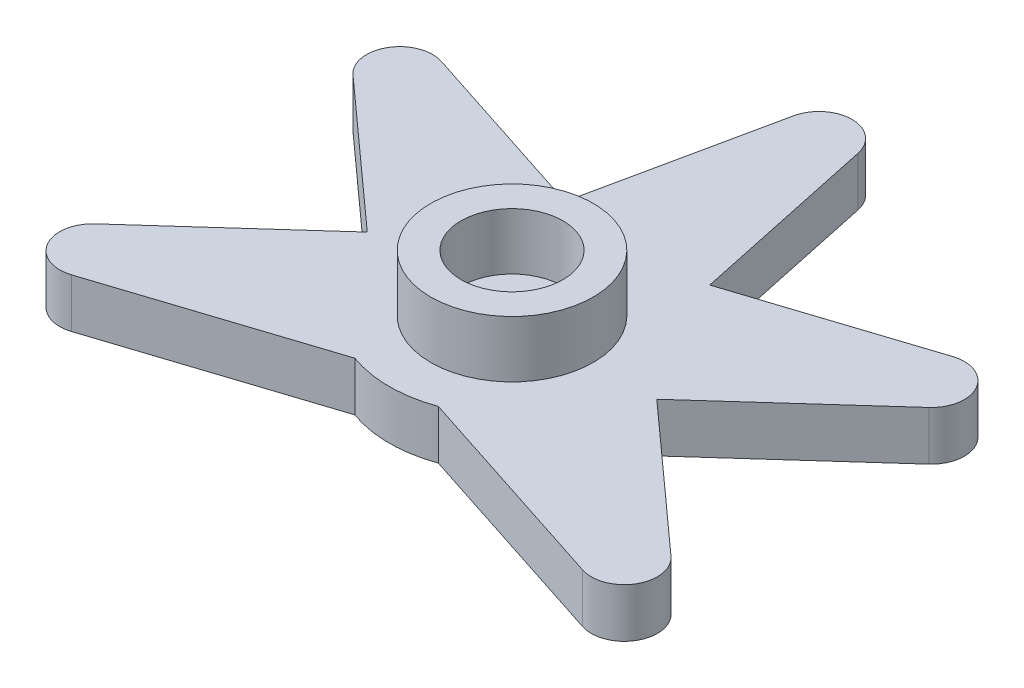
ISO-10303-21;
HEADER;
FILE_DESCRIPTION(('STEP AP214'),'2;1');
FILE_NAME('part.step','',(''),(''),'','','');
FILE_SCHEMA(('AUTOMOTIVE_DESIGN { 1 0 10303 214 1 1 1 1 }'));
ENDSEC;
DATA;
#1=APPLICATION_CONTEXT('core data for automotive mechanical design processes');
#2=APPLICATION_PROTOCOL_DEFINITION('international standard','automotive_design',2000,#1);
#3=PRODUCT_CONTEXT('',#1,'mechanical');
#4=PRODUCT('Part','Part','',(#3));
#5=PRODUCT_RELATED_PRODUCT_CATEGORY('part','',(#4));
#6=PRODUCT_DEFINITION_FORMATION('','',#4);
#7=PRODUCT_DEFINITION_CONTEXT('part definition',#1,'design');
#8=PRODUCT_DEFINITION('design','',#6,#7);
#9=PRODUCT_DEFINITION_SHAPE('','',#8);
#10=(LENGTH_UNIT() NAMED_UNIT(*) SI_UNIT(.MILLI.,.METRE.));
#11=(NAMED_UNIT(*) PLANE_ANGLE_UNIT() SI_UNIT($,.RADIAN.));
#12=(NAMED_UNIT(*) SI_UNIT($,.STERADIAN.) SOLID_ANGLE_UNIT());
#13=UNCERTAINTY_MEASURE_WITH_UNIT(LENGTH_MEASURE(1.E-05),#10,'distance_accuracy_value','');
#14=(GEOMETRIC_REPRESENTATION_CONTEXT(3) GLOBAL_UNCERTAINTY_ASSIGNED_CONTEXT((#13)) GLOBAL_UNIT_ASSIGNED_CONTEXT((#10,
#11,#12)) REPRESENTATION_CONTEXT('',''));
#15=CARTESIAN_POINT('',(0.,0.,0.));
#16=DIRECTION('',(0.,0.,1.));
#17=DIRECTION('',(1.,0.,0.));
#18=AXIS2_PLACEMENT_3D('',#15,#16,#17);
#19=CARTESIAN_POINT('',(0.,2.6,0.));
#20=DIRECTION('',(0.,1.,0.));
#21=DIRECTION('',(0.,0.,1.));
#22=AXIS2_PLACEMENT_3D('',#19,#20,#21);
#23=PLANE('',#22);
#24=CARTESIAN_POINT('',(0.,2.6,0.));
#25=DIRECTION('',(0.,1.,0.));
#26=DIRECTION('',(0.,0.,1.));
#27=AXIS2_PLACEMENT_3D('',#24,#25,#26);
#28=CIRCLE('',#27,1.5);
#29=CARTESIAN_POINT('',(0.,2.6,1.5));
#30=VERTEX_POINT('',#29);
#31=EDGE_CURVE('E197',#30,#30,#28,.T.);
#32=ORIENTED_EDGE('',*,*,#31,.F.);
#33=EDGE_LOOP('',(#32));
#34=FACE_BOUND('',#33,.T.);
#35=CARTESIAN_POINT('',(0.,2.6,0.));
#36=DIRECTION('',(0.,1.,0.));
#37=DIRECTION('',(0.,0.,1.));
#38=AXIS2_PLACEMENT_3D('',#35,#36,#37);
#39=CIRCLE('',#38,2.7);
#40=CARTESIAN_POINT('',(0.,2.6,2.7));
#41=VERTEX_POINT('',#40);
#42=EDGE_CURVE('E11',#41,#41,#39,.F.);
#43=ORIENTED_EDGE('',*,*,#42,.F.);
#44=EDGE_LOOP('',(#43));
#45=FACE_BOUND('',#44,.T.);
#46=ADVANCED_FACE('F41',(#34,#45),#23,.T.);
#47=CARTESIAN_POINT('',(0.,2.6,0.));
#48=DIRECTION('',(0.,-1.,0.));
#49=DIRECTION('',(0.,0.,-1.));
#50=AXIS2_PLACEMENT_3D('',#47,#48,#49);
#51=CYLINDRICAL_SURFACE('',#50,6.5);
#52=CARTESIAN_POINT('',(0.,0.,0.));
#53=DIRECTION('',(0.,1.,0.));
#54=DIRECTION('',(0.,0.,1.));
#55=AXIS2_PLACEMENT_3D('',#52,#53,#54);
#56=CIRCLE('',#55,6.5);
#57=CARTESIAN_POINT('',(2.21320415241707,0.,6.1116059574979));
#58=VERTEX_POINT('',#57);
#59=CARTESIAN_POINT('',(-2.21320415241724,0.,6.11160595749784));
#60=VERTEX_POINT('',#59);
#61=EDGE_CURVE('E204',#58,#60,#56,.F.);
#62=ORIENTED_EDGE('',*,*,#61,.F.);
#63=DIRECTION('',(0.,-1.,0.));
#64=VECTOR('',#63,1.);
#65=CARTESIAN_POINT('',(2.21320415241707,2.6,6.1116059574979));
#66=LINE('',#65,#64);
#67=CARTESIAN_POINT('',(2.21320415241707,2.6,6.1116059574979));
#68=VERTEX_POINT('',#67);
#69=EDGE_CURVE('E51',#68,#58,#66,.T.);
#70=ORIENTED_EDGE('',*,*,#69,.F.);
#71=CARTESIAN_POINT('',(0.,2.6,0.));
#72=DIRECTION('',(0.,1.,0.));
#73=DIRECTION('',(0.,0.,1.));
#74=AXIS2_PLACEMENT_3D('',#71,#72,#73);
#75=CIRCLE('',#74,6.5);
#76=CARTESIAN_POINT('',(-2.21320415241724,2.6,6.11160595749784));
#77=VERTEX_POINT('',#76);
#78=EDGE_CURVE('E263',#68,#77,#75,.F.);
#79=ORIENTED_EDGE('',*,*,#78,.T.);
#80=DIRECTION('',(0.,-1.,0.));
#81=VECTOR('',#80,1.);
#82=CARTESIAN_POINT('',(-2.21320415241724,2.6,6.11160595749784));
#83=LINE('',#82,#81);
#84=EDGE_CURVE('E129',#77,#60,#83,.T.);
#85=ORIENTED_EDGE('',*,*,#84,.T.);
#86=EDGE_LOOP('',(#62,#70,#79,#85));
#87=FACE_BOUND('',#86,.T.);
#88=ADVANCED_FACE('F43',(#87),#51,.T.);
#89=CARTESIAN_POINT('',(-1.58481373427491,2.6,4.87755513946669));
#90=DIRECTION('',(-0.309016994374972,0.,0.951056516295146));
#91=DIRECTION('',(0.951056516295146,0.,0.309016994374972));
#92=AXIS2_PLACEMENT_3D('',#89,#90,#91);
#93=PLANE('',#92);
#94=DIRECTION('',(-0.951056516295146,0.,-0.309016994374972));
#95=VECTOR('',#94,1.);
#96=CARTESIAN_POINT('',(-1.58481373427491,0.,4.87755513946669));
#97=LINE('',#96,#95);
#98=CARTESIAN_POINT('',(13.5321330713408,0.,9.78934890351677));
#99=VERTEX_POINT('',#98);
#100=EDGE_CURVE('E208',#99,#58,#97,.T.);
#101=ORIENTED_EDGE('',*,*,#100,.F.);
#102=DIRECTION('',(0.,-1.,0.));
#103=VECTOR('',#102,1.);
#104=CARTESIAN_POINT('',(13.5321330713408,2.6,9.78934890351677));
#105=LINE('',#104,#103);
#106=CARTESIAN_POINT('',(13.5321330713408,2.6,9.78934890351677));
#107=VERTEX_POINT('',#106);
#108=EDGE_CURVE('E294',#107,#99,#105,.T.);
#109=ORIENTED_EDGE('',*,*,#108,.F.);
#110=DIRECTION('',(-0.951056516295146,0.,-0.309016994374972));
#111=VECTOR('',#110,1.);
#112=CARTESIAN_POINT('',(-1.58481373427491,2.6,4.87755513946669));
#113=LINE('',#112,#111);
#114=EDGE_CURVE('E304',#107,#68,#113,.T.);
#115=ORIENTED_EDGE('',*,*,#114,.T.);
#116=ORIENTED_EDGE('',*,*,#69,.T.);
#117=EDGE_LOOP('',(#101,#109,#115,#116));
#118=FACE_BOUND('',#117,.T.);
#119=ADVANCED_FACE('F302',(#118),#93,.T.);
#120=CARTESIAN_POINT('',(14.072912811497,2.6,8.12500000000026));
#121=DIRECTION('',(0.,-1.,0.));
#122=DIRECTION('',(0.,0.,-1.));
#123=AXIS2_PLACEMENT_3D('',#120,#121,#122);
#124=CYLINDRICAL_SURFACE('',#123,1.75);
#125=CARTESIAN_POINT('',(14.072912811497,0.,8.12500000000026));
#126=DIRECTION('',(0.,1.,0.));
#127=DIRECTION('',(0.,0.,1.));
#128=AXIS2_PLACEMENT_3D('',#125,#126,#127);
#129=CIRCLE('',#128,1.75);
#130=CARTESIAN_POINT('',(15.243891372625,0.,6.82449655541483));
#131=VERTEX_POINT('',#130);
#132=EDGE_CURVE('E213',#131,#99,#129,.F.);
#133=ORIENTED_EDGE('',*,*,#132,.F.);
#134=DIRECTION('',(0.,-1.,0.));
#135=VECTOR('',#134,1.);
#136=CARTESIAN_POINT('',(15.243891372625,2.6,6.82449655541483));
#137=LINE('',#136,#135);
#138=CARTESIAN_POINT('',(15.243891372625,2.6,6.82449655541483));
#139=VERTEX_POINT('',#138);
#140=EDGE_CURVE('E291',#139,#131,#137,.T.);
#141=ORIENTED_EDGE('',*,*,#140,.F.);
#142=CARTESIAN_POINT('',(14.072912811497,2.6,8.12500000000026));
#143=DIRECTION('',(0.,1.,0.));
#144=DIRECTION('',(0.,0.,1.));
#145=AXIS2_PLACEMENT_3D('',#142,#143,#144);
#146=CIRCLE('',#145,1.75);
#147=EDGE_CURVE('E315',#139,#107,#146,.F.);
#148=ORIENTED_EDGE('',*,*,#147,.T.);
#149=ORIENTED_EDGE('',*,*,#108,.T.);
#150=EDGE_LOOP('',(#133,#141,#148,#149));
#151=FACE_BOUND('',#150,.T.);
#152=ADVANCED_FACE('F311',(#151),#124,.T.);
#153=CARTESIAN_POINT('',(3.43167979200019,2.6,-3.81126652388177));
#154=DIRECTION('',(-0.669130606358867,0.,0.743144825477386));
#155=DIRECTION('',(0.743144825477386,0.,0.669130606358867));
#156=AXIS2_PLACEMENT_3D('',#153,#154,#155);
#157=PLANE('',#156);
#158=DIRECTION('',(-0.743144825477386,0.,-0.669130606358867));
#159=VECTOR('',#158,1.);
#160=CARTESIAN_POINT('',(3.43167979200019,0.,-3.81126652388177));
#161=LINE('',#160,#159);
#162=CARTESIAN_POINT('',(7.6645200907729,0.,1.43765208071578E-13));
#163=VERTEX_POINT('',#162);
#164=EDGE_CURVE('E217',#131,#163,#161,.T.);
#165=ORIENTED_EDGE('',*,*,#164,.T.);
#166=DIRECTION('',(0.,-1.,0.));
#167=VECTOR('',#166,1.);
#168=CARTESIAN_POINT('',(7.6645200907729,2.6,1.43765208071578E-13));
#169=LINE('',#168,#167);
#170=CARTESIAN_POINT('',(7.6645200907729,2.6,1.43765208071578E-13));
#171=VERTEX_POINT('',#170);
#172=EDGE_CURVE('E288',#171,#163,#169,.T.);
#173=ORIENTED_EDGE('',*,*,#172,.F.);
#174=DIRECTION('',(-0.743144825477386,0.,-0.669130606358867));
#175=VECTOR('',#174,1.);
#176=CARTESIAN_POINT('',(3.43167979200019,2.6,-3.81126652388177));
#177=LINE('',#176,#175);
#178=EDGE_CURVE('E318',#139,#171,#177,.T.);
#179=ORIENTED_EDGE('',*,*,#178,.F.);
#180=ORIENTED_EDGE('',*,*,#140,.T.);
#181=EDGE_LOOP('',(#165,#173,#179,#180));
#182=FACE_BOUND('',#181,.T.);
#183=ADVANCED_FACE('F560',(#182),#157,.F.);
#184=CARTESIAN_POINT('',(3.43167979200028,2.6,3.81126652388192));
#185=DIRECTION('',(0.669130606358861,0.,0.743144825477392));
#186=DIRECTION('',(0.743144825477392,0.,-0.669130606358861));
#187=AXIS2_PLACEMENT_3D('',#184,#185,#186);
#188=PLANE('',#187);
#189=DIRECTION('',(-0.743144825477392,0.,0.669130606358861));
#190=VECTOR('',#189,1.);
#191=CARTESIAN_POINT('',(3.43167979200028,0.,3.81126652388192));
#192=LINE('',#191,#190);
#193=CARTESIAN_POINT('',(15.2438913726251,0.,-6.82449655541456));
#194=VERTEX_POINT('',#193);
#195=EDGE_CURVE('E221',#194,#163,#192,.T.);
#196=ORIENTED_EDGE('',*,*,#195,.F.);
#197=DIRECTION('',(0.,-1.,0.));
#198=VECTOR('',#197,1.);
#199=CARTESIAN_POINT('',(15.2438913726251,2.6,-6.82449655541456));
#200=LINE('',#199,#198);
#201=CARTESIAN_POINT('',(15.2438913726251,2.6,-6.82449655541456));
#202=VERTEX_POINT('',#201);
#203=EDGE_CURVE('E285',#202,#194,#200,.T.);
#204=ORIENTED_EDGE('',*,*,#203,.F.);
#205=DIRECTION('',(-0.743144825477392,0.,0.669130606358861));
#206=VECTOR('',#205,1.);
#207=CARTESIAN_POINT('',(3.43167979200028,2.6,3.81126652388192));
#208=LINE('',#207,#206);
#209=EDGE_CURVE('E325',#202,#171,#208,.T.);
#210=ORIENTED_EDGE('',*,*,#209,.T.);
#211=ORIENTED_EDGE('',*,*,#172,.T.);
#212=EDGE_LOOP('',(#196,#204,#210,#211));
#213=FACE_BOUND('',#212,.T.);
#214=ADVANCED_FACE('F551',(#213),#188,.T.);
#215=CARTESIAN_POINT('',(14.0729128114971,2.6,-8.125));
#216=DIRECTION('',(0.,-1.,0.));
#217=DIRECTION('',(0.,0.,-1.));
#218=AXIS2_PLACEMENT_3D('',#215,#216,#217);
#219=CYLINDRICAL_SURFACE('',#218,1.75);
#220=CARTESIAN_POINT('',(14.0729128114971,0.,-8.125));
#221=DIRECTION('',(0.,1.,0.));
#222=DIRECTION('',(0.,0.,1.));
#223=AXIS2_PLACEMENT_3D('',#220,#221,#222);
#224=CIRCLE('',#223,1.75);
#225=CARTESIAN_POINT('',(13.532133071341,0.,-9.78934890351652));
#226=VERTEX_POINT('',#225);
#227=EDGE_CURVE('E225',#226,#194,#224,.F.);
#228=ORIENTED_EDGE('',*,*,#227,.F.);
#229=DIRECTION('',(0.,-1.,0.));
#230=VECTOR('',#229,1.);
#231=CARTESIAN_POINT('',(13.532133071341,2.6,-9.78934890351652));
#232=LINE('',#231,#230);
#233=CARTESIAN_POINT('',(13.532133071341,2.6,-9.78934890351652));
#234=VERTEX_POINT('',#233);
#235=EDGE_CURVE('E282',#234,#226,#232,.T.);
#236=ORIENTED_EDGE('',*,*,#235,.F.);
#237=CARTESIAN_POINT('',(14.0729128114971,2.6,-8.125));
#238=DIRECTION('',(0.,1.,0.));
#239=DIRECTION('',(0.,0.,1.));
#240=AXIS2_PLACEMENT_3D('',#237,#238,#239);
#241=CIRCLE('',#240,1.75);
#242=EDGE_CURVE('E329',#234,#202,#241,.F.);
#243=ORIENTED_EDGE('',*,*,#242,.T.);
#244=ORIENTED_EDGE('',*,*,#203,.T.);
#245=EDGE_LOOP('',(#228,#236,#243,#244));
#246=FACE_BOUND('',#245,.T.);
#247=ADVANCED_FACE('F542',(#246),#219,.T.);
#248=CARTESIAN_POINT('',(-1.58481373427482,2.6,-4.87755513946679));
#249=DIRECTION('',(0.30901699437495,0.,0.951056516295153));
#250=DIRECTION('',(0.951056516295153,0.,-0.30901699437495));
#251=AXIS2_PLACEMENT_3D('',#248,#249,#250);
#252=PLANE('',#251);
#253=DIRECTION('',(-0.951056516295153,0.,0.30901699437495));
#254=VECTOR('',#253,1.);
#255=CARTESIAN_POINT('',(-1.58481373427482,0.,-4.87755513946679));
#256=LINE('',#255,#254);
#257=CARTESIAN_POINT('',(3.83226004538644,0.,-6.63766910642558));
#258=VERTEX_POINT('',#257);
#259=EDGE_CURVE('E229',#226,#258,#256,.T.);
#260=ORIENTED_EDGE('',*,*,#259,.T.);
#261=DIRECTION('',(0.,-1.,0.));
#262=VECTOR('',#261,1.);
#263=CARTESIAN_POINT('',(3.83226004538644,2.6,-6.63766910642558));
#264=LINE('',#263,#262);
#265=CARTESIAN_POINT('',(3.83226004538644,2.6,-6.63766910642558));
#266=VERTEX_POINT('',#265);
#267=EDGE_CURVE('E279',#266,#258,#264,.T.);
#268=ORIENTED_EDGE('',*,*,#267,.F.);
#269=DIRECTION('',(-0.951056516295153,0.,0.30901699437495));
#270=VECTOR('',#269,1.);
#271=CARTESIAN_POINT('',(-1.58481373427482,2.6,-4.87755513946679));
#272=LINE('',#271,#270);
#273=EDGE_CURVE('E333',#234,#266,#272,.T.);
#274=ORIENTED_EDGE('',*,*,#273,.F.);
#275=ORIENTED_EDGE('',*,*,#235,.T.);
#276=EDGE_LOOP('',(#260,#268,#274,#275));
#277=FACE_BOUND('',#276,.T.);
#278=ADVANCED_FACE('F531',(#277),#252,.F.);
#279=CARTESIAN_POINT('',(5.01649352627494,2.6,-1.06628861558489));
#280=DIRECTION('',(0.978147600733807,0.,-0.207911690817753));
#281=DIRECTION('',(-0.207911690817753,0.,-0.978147600733807));
#282=AXIS2_PLACEMENT_3D('',#279,#280,#281);
#283=PLANE('',#282);
#284=DIRECTION('',(0.207911690817753,0.,0.978147600733807));
#285=VECTOR('',#284,1.);
#286=CARTESIAN_POINT('',(5.01649352627494,0.,-1.06628861558489));
#287=LINE('',#286,#285);
#288=CARTESIAN_POINT('',(1.71175830128416,0.,-16.6138454589311));
#289=VERTEX_POINT('',#288);
#290=EDGE_CURVE('E233',#289,#258,#287,.T.);
#291=ORIENTED_EDGE('',*,*,#290,.F.);
#292=DIRECTION('',(0.,-1.,0.));
#293=VECTOR('',#292,1.);
#294=CARTESIAN_POINT('',(1.71175830128416,2.6,-16.6138454589311));
#295=LINE('',#294,#293);
#296=CARTESIAN_POINT('',(1.71175830128416,2.6,-16.6138454589311));
#297=VERTEX_POINT('',#296);
#298=EDGE_CURVE('E277',#297,#289,#295,.T.);
#299=ORIENTED_EDGE('',*,*,#298,.F.);
#300=DIRECTION('',(0.207911690817753,0.,0.978147600733807));
#301=VECTOR('',#300,1.);
#302=CARTESIAN_POINT('',(5.01649352627494,2.6,-1.06628861558489));
#303=LINE('',#302,#301);
#304=EDGE_CURVE('E336',#297,#266,#303,.T.);
#305=ORIENTED_EDGE('',*,*,#304,.T.);
#306=ORIENTED_EDGE('',*,*,#267,.T.);
#307=EDGE_LOOP('',(#291,#299,#305,#306));
#308=FACE_BOUND('',#307,.T.);
#309=ADVANCED_FACE('F521',(#308),#283,.T.);
#310=CARTESIAN_POINT('',(0.,2.6,-16.25));
#311=DIRECTION('',(0.,-1.,0.));
#312=DIRECTION('',(0.,0.,-1.));
#313=AXIS2_PLACEMENT_3D('',#310,#311,#312);
#314=CYLINDRICAL_SURFACE('',#313,1.75);
#315=CARTESIAN_POINT('',(0.,0.,-16.25));
#316=DIRECTION('',(0.,1.,0.));
#317=DIRECTION('',(0.,0.,1.));
#318=AXIS2_PLACEMENT_3D('',#315,#316,#317);
#319=CIRCLE('',#318,1.75);
#320=CARTESIAN_POINT('',(-1.71175830128416,0.,-16.6138454589311));
#321=VERTEX_POINT('',#320);
#322=EDGE_CURVE('E237',#321,#289,#319,.F.);
#323=ORIENTED_EDGE('',*,*,#322,.F.);
#324=DIRECTION('',(0.,-1.,0.));
#325=VECTOR('',#324,1.);
#326=CARTESIAN_POINT('',(-1.71175830128416,2.6,-16.6138454589311));
#327=LINE('',#326,#325);
#328=CARTESIAN_POINT('',(-1.71175830128416,2.6,-16.6138454589311));
#329=VERTEX_POINT('',#328);
#330=EDGE_CURVE('E275',#329,#321,#327,.T.);
#331=ORIENTED_EDGE('',*,*,#330,.F.);
#332=CARTESIAN_POINT('',(0.,2.6,-16.25));
#333=DIRECTION('',(0.,1.,0.));
#334=DIRECTION('',(0.,0.,1.));
#335=AXIS2_PLACEMENT_3D('',#332,#333,#334);
#336=CIRCLE('',#335,1.75);
#337=EDGE_CURVE('E339',#329,#297,#336,.F.);
#338=ORIENTED_EDGE('',*,*,#337,.T.);
#339=ORIENTED_EDGE('',*,*,#298,.T.);
#340=EDGE_LOOP('',(#323,#331,#338,#339));
#341=FACE_BOUND('',#340,.T.);
#342=ADVANCED_FACE('F511',(#341),#314,.T.);
#343=CARTESIAN_POINT('',(-5.01649352627494,2.6,-1.06628861558489));
#344=DIRECTION('',(0.978147600733807,0.,0.207911690817753));
#345=DIRECTION('',(0.207911690817753,0.,-0.978147600733807));
#346=AXIS2_PLACEMENT_3D('',#343,#344,#345);
#347=PLANE('',#346);
#348=DIRECTION('',(-0.207911690817753,0.,0.978147600733807));
#349=VECTOR('',#348,1.);
#350=CARTESIAN_POINT('',(-5.01649352627494,0.,-1.06628861558489));
#351=LINE('',#350,#349);
#352=CARTESIAN_POINT('',(-3.83226004538643,0.,-6.63766910642561));
#353=VERTEX_POINT('',#352);
#354=EDGE_CURVE('E240',#321,#353,#351,.T.);
#355=ORIENTED_EDGE('',*,*,#354,.T.);
#356=DIRECTION('',(0.,-1.,0.));
#357=VECTOR('',#356,1.);
#358=CARTESIAN_POINT('',(-3.83226004538643,2.6,-6.63766910642561));
#359=LINE('',#358,#357);
#360=CARTESIAN_POINT('',(-3.83226004538643,2.6,-6.63766910642561));
#361=VERTEX_POINT('',#360);
#362=EDGE_CURVE('E272',#361,#353,#359,.T.);
#363=ORIENTED_EDGE('',*,*,#362,.F.);
#364=DIRECTION('',(-0.207911690817753,0.,0.978147600733807));
#365=VECTOR('',#364,1.);
#366=CARTESIAN_POINT('',(-5.01649352627494,2.6,-1.06628861558489));
#367=LINE('',#366,#365);
#368=EDGE_CURVE('E342',#329,#361,#367,.T.);
#369=ORIENTED_EDGE('',*,*,#368,.F.);
#370=ORIENTED_EDGE('',*,*,#330,.T.);
#371=EDGE_LOOP('',(#355,#363,#369,#370));
#372=FACE_BOUND('',#371,.T.);
#373=ADVANCED_FACE('F502',(#372),#347,.F.);
#374=CARTESIAN_POINT('',(1.58481373427487,2.6,-4.8775551394667));
#375=DIRECTION('',(0.309016994374965,0.,-0.951056516295148));
#376=DIRECTION('',(-0.951056516295148,0.,-0.309016994374965));
#377=AXIS2_PLACEMENT_3D('',#374,#375,#376);
#378=PLANE('',#377);
#379=DIRECTION('',(0.951056516295148,0.,0.309016994374965));
#380=VECTOR('',#379,1.);
#381=CARTESIAN_POINT('',(1.58481373427487,0.,-4.8775551394667));
#382=LINE('',#381,#380);
#383=CARTESIAN_POINT('',(-13.5321330713408,0.,-9.78934890351667));
#384=VERTEX_POINT('',#383);
#385=EDGE_CURVE('E244',#384,#353,#382,.T.);
#386=ORIENTED_EDGE('',*,*,#385,.F.);
#387=DIRECTION('',(0.,-1.,0.));
#388=VECTOR('',#387,1.);
#389=CARTESIAN_POINT('',(-13.5321330713408,2.6,-9.78934890351667));
#390=LINE('',#389,#388);
#391=CARTESIAN_POINT('',(-13.5321330713408,2.6,-9.78934890351667));
#392=VERTEX_POINT('',#391);
#393=EDGE_CURVE('E270',#392,#384,#390,.T.);
#394=ORIENTED_EDGE('',*,*,#393,.F.);
#395=DIRECTION('',(0.951056516295148,0.,0.309016994374965));
#396=VECTOR('',#395,1.);
#397=CARTESIAN_POINT('',(1.58481373427487,2.6,-4.8775551394667));
#398=LINE('',#397,#396);
#399=EDGE_CURVE('E344',#392,#361,#398,.T.);
#400=ORIENTED_EDGE('',*,*,#399,.T.);
#401=ORIENTED_EDGE('',*,*,#362,.T.);
#402=EDGE_LOOP('',(#386,#394,#400,#401));
#403=FACE_BOUND('',#402,.T.);
#404=ADVANCED_FACE('F358',(#403),#378,.T.);
#405=CARTESIAN_POINT('',(-14.072912811497,2.6,-8.12500000000016));
#406=DIRECTION('',(0.,-1.,0.));
#407=DIRECTION('',(0.,0.,-1.));
#408=AXIS2_PLACEMENT_3D('',#405,#406,#407);
#409=CYLINDRICAL_SURFACE('',#408,1.75);
#410=CARTESIAN_POINT('',(-14.072912811497,0.,-8.12500000000016));
#411=DIRECTION('',(0.,1.,0.));
#412=DIRECTION('',(0.,0.,1.));
#413=AXIS2_PLACEMENT_3D('',#410,#411,#412);
#414=CIRCLE('',#413,1.75);
#415=CARTESIAN_POINT('',(-15.243891372625,0.,-6.82449655541473));
#416=VERTEX_POINT('',#415);
#417=EDGE_CURVE('E248',#416,#384,#414,.F.);
#418=ORIENTED_EDGE('',*,*,#417,.F.);
#419=DIRECTION('',(0.,-1.,0.));
#420=VECTOR('',#419,1.);
#421=CARTESIAN_POINT('',(-15.243891372625,2.6,-6.82449655541473));
#422=LINE('',#421,#420);
#423=CARTESIAN_POINT('',(-15.243891372625,2.6,-6.82449655541473));
#424=VERTEX_POINT('',#423);
#425=EDGE_CURVE('E268',#424,#416,#422,.T.);
#426=ORIENTED_EDGE('',*,*,#425,.F.);
#427=CARTESIAN_POINT('',(-14.072912811497,2.6,-8.12500000000016));
#428=DIRECTION('',(0.,1.,0.));
#429=DIRECTION('',(0.,0.,1.));
#430=AXIS2_PLACEMENT_3D('',#427,#428,#429);
#431=CIRCLE('',#430,1.75);
#432=EDGE_CURVE('E347',#424,#392,#431,.F.);
#433=ORIENTED_EDGE('',*,*,#432,.T.);
#434=ORIENTED_EDGE('',*,*,#393,.T.);
#435=EDGE_LOOP('',(#418,#426,#433,#434));
#436=FACE_BOUND('',#435,.T.);
#437=ADVANCED_FACE('F351',(#436),#409,.T.);
#438=CARTESIAN_POINT('',(-3.43167979200017,2.6,3.81126652388179));
#439=DIRECTION('',(0.669130606358862,0.,-0.743144825477391));
#440=DIRECTION('',(-0.743144825477391,0.,-0.669130606358862));
#441=AXIS2_PLACEMENT_3D('',#438,#439,#440);
#442=PLANE('',#441);
#443=DIRECTION('',(0.743144825477391,0.,0.669130606358862));
#444=VECTOR('',#443,1.);
#445=CARTESIAN_POINT('',(-3.43167979200017,0.,3.81126652388179));
#446=LINE('',#445,#444);
#447=CARTESIAN_POINT('',(-7.66452009077289,0.,0.));
#448=VERTEX_POINT('',#447);
#449=EDGE_CURVE('E251',#416,#448,#446,.T.);
#450=ORIENTED_EDGE('',*,*,#449,.T.);
#451=DIRECTION('',(0.,-1.,0.));
#452=VECTOR('',#451,1.);
#453=CARTESIAN_POINT('',(-7.66452009077289,2.6,0.));
#454=LINE('',#453,#452);
#455=CARTESIAN_POINT('',(-7.66452009077289,2.6,0.));
#456=VERTEX_POINT('',#455);
#457=EDGE_CURVE('E185',#456,#448,#454,.T.);
#458=ORIENTED_EDGE('',*,*,#457,.F.);
#459=DIRECTION('',(0.743144825477391,0.,0.669130606358862));
#460=VECTOR('',#459,1.);
#461=CARTESIAN_POINT('',(-3.43167979200017,2.6,3.81126652388179));
#462=LINE('',#461,#460);
#463=EDGE_CURVE('E191',#424,#456,#462,.T.);
#464=ORIENTED_EDGE('',*,*,#463,.F.);
#465=ORIENTED_EDGE('',*,*,#425,.T.);
#466=EDGE_LOOP('',(#450,#458,#464,#465));
#467=FACE_BOUND('',#466,.T.);
#468=ADVANCED_FACE('F362',(#467),#442,.F.);
#469=CARTESIAN_POINT('',(-3.43167979200009,2.6,-3.81126652388186));
#470=DIRECTION('',(-0.669130606358846,0.,-0.743144825477405));
#471=DIRECTION('',(-0.743144825477405,0.,0.669130606358846));
#472=AXIS2_PLACEMENT_3D('',#469,#470,#471);
#473=PLANE('',#472);
#474=DIRECTION('',(0.743144825477405,0.,-0.669130606358846));
#475=VECTOR('',#474,1.);
#476=CARTESIAN_POINT('',(-3.43167979200009,0.,-3.81126652388186));
#477=LINE('',#476,#475);
#478=CARTESIAN_POINT('',(-15.2438913726252,0.,6.82449655541441));
#479=VERTEX_POINT('',#478);
#480=EDGE_CURVE('E180',#479,#448,#477,.T.);
#481=ORIENTED_EDGE('',*,*,#480,.F.);
#482=DIRECTION('',(0.,-1.,0.));
#483=VECTOR('',#482,1.);
#484=CARTESIAN_POINT('',(-15.2438913726252,2.6,6.82449655541441));
#485=LINE('',#484,#483);
#486=CARTESIAN_POINT('',(-15.2438913726252,2.6,6.82449655541441));
#487=VERTEX_POINT('',#486);
#488=EDGE_CURVE('E175',#487,#479,#485,.T.);
#489=ORIENTED_EDGE('',*,*,#488,.F.);
#490=DIRECTION('',(0.743144825477405,0.,-0.669130606358846));
#491=VECTOR('',#490,1.);
#492=CARTESIAN_POINT('',(-3.43167979200009,2.6,-3.81126652388186));
#493=LINE('',#492,#491);
#494=EDGE_CURVE('E178',#487,#456,#493,.T.);
#495=ORIENTED_EDGE('',*,*,#494,.T.);
#496=ORIENTED_EDGE('',*,*,#457,.T.);
#497=EDGE_LOOP('',(#481,#489,#495,#496));
#498=FACE_BOUND('',#497,.T.);
#499=ADVANCED_FACE('F177',(#498),#473,.T.);
#500=CARTESIAN_POINT('',(-14.0729128114972,2.6,8.12499999999987));
#501=DIRECTION('',(0.,-1.,0.));
#502=DIRECTION('',(0.,0.,-1.));
#503=AXIS2_PLACEMENT_3D('',#500,#501,#502);
#504=CYLINDRICAL_SURFACE('',#503,1.75);
#505=CARTESIAN_POINT('',(-14.0729128114972,0.,8.12499999999987));
#506=DIRECTION('',(0.,1.,0.));
#507=DIRECTION('',(0.,0.,1.));
#508=AXIS2_PLACEMENT_3D('',#505,#506,#507);
#509=CIRCLE('',#508,1.75);
#510=CARTESIAN_POINT('',(-13.532133071341,0.,9.78934890351639));
#511=VERTEX_POINT('',#510);
#512=EDGE_CURVE('E255',#511,#479,#509,.F.);
#513=ORIENTED_EDGE('',*,*,#512,.F.);
#514=DIRECTION('',(0.,-1.,0.));
#515=VECTOR('',#514,1.);
#516=CARTESIAN_POINT('',(-13.532133071341,2.6,9.78934890351639));
#517=LINE('',#516,#515);
#518=CARTESIAN_POINT('',(-13.532133071341,2.6,9.78934890351639));
#519=VERTEX_POINT('',#518);
#520=EDGE_CURVE('E121',#519,#511,#517,.T.);
#521=ORIENTED_EDGE('',*,*,#520,.F.);
#522=CARTESIAN_POINT('',(-14.0729128114972,2.6,8.12499999999987));
#523=DIRECTION('',(0.,1.,0.));
#524=DIRECTION('',(0.,0.,1.));
#525=AXIS2_PLACEMENT_3D('',#522,#523,#524);
#526=CIRCLE('',#525,1.75);
#527=EDGE_CURVE('E188',#519,#487,#526,.F.);
#528=ORIENTED_EDGE('',*,*,#527,.T.);
#529=ORIENTED_EDGE('',*,*,#488,.T.);
#530=EDGE_LOOP('',(#513,#521,#528,#529));
#531=FACE_BOUND('',#530,.T.);
#532=ADVANCED_FACE('F194',(#531),#504,.T.);
#533=CARTESIAN_POINT('',(1.58481373427477,2.6,4.87755513946674));
#534=DIRECTION('',(-0.309016994374945,0.,-0.951056516295154));
#535=DIRECTION('',(-0.951056516295154,0.,0.309016994374945));
#536=AXIS2_PLACEMENT_3D('',#533,#534,#535);
#537=PLANE('',#536);
#538=DIRECTION('',(0.951056516295155,0.,-0.309016994374945));
#539=VECTOR('',#538,1.);
#540=CARTESIAN_POINT('',(1.58481373427477,0.,4.87755513946674));
#541=LINE('',#540,#539);
#542=EDGE_CURVE('E257',#511,#60,#541,.T.);
#543=ORIENTED_EDGE('',*,*,#542,.T.);
#544=ORIENTED_EDGE('',*,*,#84,.F.);
#545=DIRECTION('',(0.951056516295155,0.,-0.309016994374945));
#546=VECTOR('',#545,1.);
#547=CARTESIAN_POINT('',(1.58481373427477,2.6,4.87755513946674));
#548=LINE('',#547,#546);
#549=EDGE_CURVE('E61',#519,#77,#548,.T.);
#550=ORIENTED_EDGE('',*,*,#549,.F.);
#551=ORIENTED_EDGE('',*,*,#520,.T.);
#552=EDGE_LOOP('',(#543,#544,#550,#551));
#553=FACE_BOUND('',#552,.T.);
#554=ADVANCED_FACE('F389',(#553),#537,.F.);
#555=CARTESIAN_POINT('',(0.,2.6,0.));
#556=DIRECTION('',(0.,-1.,0.));
#557=DIRECTION('',(0.,0.,-1.));
#558=AXIS2_PLACEMENT_3D('',#555,#556,#557);
#559=CYLINDRICAL_SURFACE('',#558,1.5);
#560=ORIENTED_EDGE('',*,*,#31,.T.);
#561=EDGE_LOOP('',(#560));
#562=FACE_BOUND('',#561,.T.);
#563=CARTESIAN_POINT('',(0.,0.,0.));
#564=DIRECTION('',(0.,1.,0.));
#565=DIRECTION('',(0.,0.,1.));
#566=AXIS2_PLACEMENT_3D('',#563,#564,#565);
#567=CIRCLE('',#566,1.5);
#568=CARTESIAN_POINT('',(0.,0.,1.5));
#569=VERTEX_POINT('',#568);
#570=EDGE_CURVE('E260',#569,#569,#567,.T.);
#571=ORIENTED_EDGE('',*,*,#570,.F.);
#572=EDGE_LOOP('',(#571));
#573=FACE_BOUND('',#572,.T.);
#574=ADVANCED_FACE('F382',(#562,#573),#559,.F.);
#575=CARTESIAN_POINT('',(0.,2.6,0.));
#576=DIRECTION('',(0.,1.,0.));
#577=DIRECTION('',(0.,0.,1.));
#578=AXIS2_PLACEMENT_3D('',#575,#576,#577);
#579=CIRCLE('',#578,4.3);
#580=CARTESIAN_POINT('',(0.,2.6,4.3));
#581=VERTEX_POINT('',#580);
#582=EDGE_CURVE('E394',#581,#581,#579,.T.);
#583=ORIENTED_EDGE('',*,*,#582,.F.);
#584=EDGE_LOOP('',(#583));
#585=FACE_BOUND('',#584,.T.);
#586=ORIENTED_EDGE('',*,*,#78,.F.);
#587=ORIENTED_EDGE('',*,*,#114,.F.);
#588=ORIENTED_EDGE('',*,*,#147,.F.);
#589=ORIENTED_EDGE('',*,*,#178,.T.);
#590=ORIENTED_EDGE('',*,*,#209,.F.);
#591=ORIENTED_EDGE('',*,*,#242,.F.);
#592=ORIENTED_EDGE('',*,*,#273,.T.);
#593=ORIENTED_EDGE('',*,*,#304,.F.);
#594=ORIENTED_EDGE('',*,*,#337,.F.);
#595=ORIENTED_EDGE('',*,*,#368,.T.);
#596=ORIENTED_EDGE('',*,*,#399,.F.);
#597=ORIENTED_EDGE('',*,*,#432,.F.);
#598=ORIENTED_EDGE('',*,*,#463,.T.);
#599=ORIENTED_EDGE('',*,*,#494,.F.);
#600=ORIENTED_EDGE('',*,*,#527,.F.);
#601=ORIENTED_EDGE('',*,*,#549,.T.);
#602=EDGE_LOOP('',(#586,#587,#588,#589,#590,#591,#592,#593,#594,#595,#596,#597,#598,#599,#600,#601));
#603=FACE_BOUND('',#602,.T.);
#604=ADVANCED_FACE('F187',(#585,#603),#23,.T.);
#605=CARTESIAN_POINT('',(0.,0.,0.));
#606=DIRECTION('',(0.,1.,0.));
#607=DIRECTION('',(0.,0.,1.));
#608=AXIS2_PLACEMENT_3D('',#605,#606,#607);
#609=PLANE('',#608);
#610=ORIENTED_EDGE('',*,*,#61,.T.);
#611=ORIENTED_EDGE('',*,*,#542,.F.);
#612=ORIENTED_EDGE('',*,*,#512,.T.);
#613=ORIENTED_EDGE('',*,*,#480,.T.);
#614=ORIENTED_EDGE('',*,*,#449,.F.);
#615=ORIENTED_EDGE('',*,*,#417,.T.);
#616=ORIENTED_EDGE('',*,*,#385,.T.);
#617=ORIENTED_EDGE('',*,*,#354,.F.);
#618=ORIENTED_EDGE('',*,*,#322,.T.);
#619=ORIENTED_EDGE('',*,*,#290,.T.);
#620=ORIENTED_EDGE('',*,*,#259,.F.);
#621=ORIENTED_EDGE('',*,*,#227,.T.);
#622=ORIENTED_EDGE('',*,*,#195,.T.);
#623=ORIENTED_EDGE('',*,*,#164,.F.);
#624=ORIENTED_EDGE('',*,*,#132,.T.);
#625=ORIENTED_EDGE('',*,*,#100,.T.);
#626=EDGE_LOOP('',(#610,#611,#612,#613,#614,#615,#616,#617,#618,#619,#620,#621,#622,#623,#624,#625));
#627=FACE_BOUND('',#626,.T.);
#628=ORIENTED_EDGE('',*,*,#570,.T.);
#629=EDGE_LOOP('',(#628));
#630=FACE_BOUND('',#629,.T.);
#631=ADVANCED_FACE('F306',(#627,#630),#609,.F.);
#632=CARTESIAN_POINT('',(0.,5.6,0.));
#633=DIRECTION('',(0.,1.,0.));
#634=DIRECTION('',(0.,0.,1.));
#635=AXIS2_PLACEMENT_3D('',#632,#633,#634);
#636=PLANE('',#635);
#637=CARTESIAN_POINT('',(0.,5.6,0.));
#638=DIRECTION('',(0.,1.,0.));
#639=DIRECTION('',(0.,0.,1.));
#640=AXIS2_PLACEMENT_3D('',#637,#638,#639);
#641=CIRCLE('',#640,4.3);
#642=CARTESIAN_POINT('',(0.,5.6,4.3));
#643=VERTEX_POINT('',#642);
#644=EDGE_CURVE('E209',#643,#643,#641,.T.);
#645=ORIENTED_EDGE('',*,*,#644,.T.);
#646=EDGE_LOOP('',(#645));
#647=FACE_BOUND('',#646,.T.);
#648=CARTESIAN_POINT('',(0.,5.6,0.));
#649=DIRECTION('',(0.,1.,0.));
#650=DIRECTION('',(0.,0.,1.));
#651=AXIS2_PLACEMENT_3D('',#648,#649,#650);
#652=CIRCLE('',#651,2.7);
#653=CARTESIAN_POINT('',(0.,5.6,2.7));
#654=VERTEX_POINT('',#653);
#655=EDGE_CURVE('E397',#654,#654,#652,.T.);
#656=ORIENTED_EDGE('',*,*,#655,.F.);
#657=EDGE_LOOP('',(#656));
#658=FACE_BOUND('',#657,.T.);
#659=ADVANCED_FACE('F388',(#647,#658),#636,.T.);
#660=CARTESIAN_POINT('',(0.,5.6,0.));
#661=DIRECTION('',(0.,-1.,0.));
#662=DIRECTION('',(0.,0.,-1.));
#663=AXIS2_PLACEMENT_3D('',#660,#661,#662);
#664=CYLINDRICAL_SURFACE('',#663,4.3);
#665=ORIENTED_EDGE('',*,*,#644,.F.);
#666=EDGE_LOOP('',(#665));
#667=FACE_BOUND('',#666,.T.);
#668=ORIENTED_EDGE('',*,*,#582,.T.);
#669=EDGE_LOOP('',(#668));
#670=FACE_BOUND('',#669,.T.);
#671=ADVANCED_FACE('F410',(#667,#670),#664,.T.);
#672=CARTESIAN_POINT('',(0.,5.6,0.));
#673=DIRECTION('',(0.,-1.,0.));
#674=DIRECTION('',(0.,0.,-1.));
#675=AXIS2_PLACEMENT_3D('',#672,#673,#674);
#676=CYLINDRICAL_SURFACE('',#675,2.7);
#677=ORIENTED_EDGE('',*,*,#655,.T.);
#678=EDGE_LOOP('',(#677));
#679=FACE_BOUND('',#678,.T.);
#680=ORIENTED_EDGE('',*,*,#42,.T.);
#681=EDGE_LOOP('',(#680));
#682=FACE_BOUND('',#681,.T.);
#683=ADVANCED_FACE('F406',(#679,#682),#676,.F.);
#684=CLOSED_SHELL('',(#46,#88,#119,#152,#183,#214,#247,#278,#309,#342,#373,#404,#437,#468,#499,
#532,#554,#574,#604,#631,#659,#671,#683));
#685=MANIFOLD_SOLID_BREP('B2',#684);
#686=ADVANCED_BREP_SHAPE_REPRESENTATION('',(#18,#685),#14);
#687=SHAPE_DEFINITION_REPRESENTATION(#9,#686);
ENDSEC;
END-ISO-10303-21;
